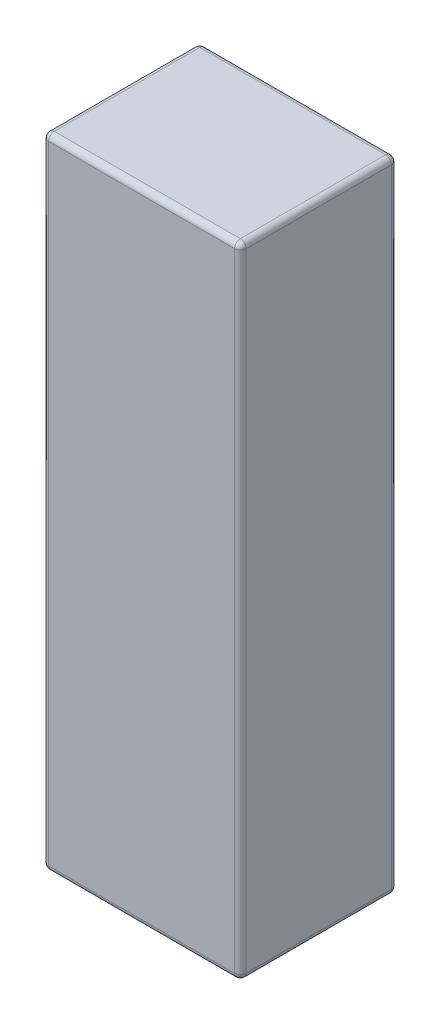
ISO-10303-21;
HEADER;
FILE_DESCRIPTION(('STEP AP214'),'2;1');
FILE_NAME('part.step','',(''),(''),'','','');
FILE_SCHEMA(('AUTOMOTIVE_DESIGN { 1 0 10303 214 1 1 1 1 }'));
ENDSEC;
DATA;
#1=APPLICATION_CONTEXT('core data for automotive mechanical design processes');
#2=APPLICATION_PROTOCOL_DEFINITION('international standard','automotive_design',2000,#1);
#3=PRODUCT_CONTEXT('',#1,'mechanical');
#4=PRODUCT('Part','Part','',(#3));
#5=PRODUCT_RELATED_PRODUCT_CATEGORY('part','',(#4));
#6=PRODUCT_DEFINITION_FORMATION('','',#4);
#7=PRODUCT_DEFINITION_CONTEXT('part definition',#1,'design');
#8=PRODUCT_DEFINITION('design','',#6,#7);
#9=PRODUCT_DEFINITION_SHAPE('','',#8);
#10=(LENGTH_UNIT() NAMED_UNIT(*) SI_UNIT(.MILLI.,.METRE.));
#11=(NAMED_UNIT(*) PLANE_ANGLE_UNIT() SI_UNIT($,.RADIAN.));
#12=(NAMED_UNIT(*) SI_UNIT($,.STERADIAN.) SOLID_ANGLE_UNIT());
#13=UNCERTAINTY_MEASURE_WITH_UNIT(LENGTH_MEASURE(1.E-05),#10,'distance_accuracy_value','');
#14=(GEOMETRIC_REPRESENTATION_CONTEXT(3) GLOBAL_UNCERTAINTY_ASSIGNED_CONTEXT((#13)) GLOBAL_UNIT_ASSIGNED_CONTEXT((#10,
#11,#12)) REPRESENTATION_CONTEXT('',''));
#15=CARTESIAN_POINT('',(0.,0.,0.));
#16=DIRECTION('',(0.,0.,1.));
#17=DIRECTION('',(1.,0.,0.));
#18=AXIS2_PLACEMENT_3D('',#15,#16,#17);
#19=CARTESIAN_POINT('',(8.5,55.,-6.75));
#20=DIRECTION('',(-1.,0.,0.));
#21=DIRECTION('',(0.,0.,1.));
#22=AXIS2_PLACEMENT_3D('',#19,#20,#21);
#23=PLANE('',#22);
#24=DIRECTION('',(0.,-1.,0.));
#25=VECTOR('',#24,1.);
#26=CARTESIAN_POINT('',(8.5,55.,-6.25));
#27=LINE('',#26,#25);
#28=CARTESIAN_POINT('',(8.5,0.5,-6.25));
#29=VERTEX_POINT('',#28);
#30=CARTESIAN_POINT('',(8.5,54.5,-6.25));
#31=VERTEX_POINT('',#30);
#32=EDGE_CURVE('E157',#29,#31,#27,.F.);
#33=ORIENTED_EDGE('',*,*,#32,.T.);
#34=DIRECTION('',(0.,0.,-1.));
#35=VECTOR('',#34,1.);
#36=CARTESIAN_POINT('',(8.5,54.5,6.75));
#37=LINE('',#36,#35);
#38=CARTESIAN_POINT('',(8.5,54.5,6.25));
#39=VERTEX_POINT('',#38);
#40=EDGE_CURVE('E130',#31,#39,#37,.F.);
#41=ORIENTED_EDGE('',*,*,#40,.T.);
#42=DIRECTION('',(0.,-1.,0.));
#43=VECTOR('',#42,1.);
#44=CARTESIAN_POINT('',(8.5,55.,6.25));
#45=LINE('',#44,#43);
#46=CARTESIAN_POINT('',(8.5,0.5,6.25));
#47=VERTEX_POINT('',#46);
#48=EDGE_CURVE('E165',#39,#47,#45,.T.);
#49=ORIENTED_EDGE('',*,*,#48,.T.);
#50=DIRECTION('',(0.,0.,-1.));
#51=VECTOR('',#50,1.);
#52=CARTESIAN_POINT('',(8.5,0.5,-6.75));
#53=LINE('',#52,#51);
#54=EDGE_CURVE('E159',#47,#29,#53,.T.);
#55=ORIENTED_EDGE('',*,*,#54,.T.);
#56=EDGE_LOOP('',(#33,#41,#49,#55));
#57=FACE_BOUND('',#56,.T.);
#58=ADVANCED_FACE('F34',(#57),#23,.F.);
#59=CARTESIAN_POINT('',(-8.5,55.,-6.75));
#60=DIRECTION('',(0.,0.,1.));
#61=DIRECTION('',(1.,0.,0.));
#62=AXIS2_PLACEMENT_3D('',#59,#60,#61);
#63=PLANE('',#62);
#64=DIRECTION('',(-1.,0.,0.));
#65=VECTOR('',#64,1.);
#66=CARTESIAN_POINT('',(8.5,54.5,-6.75));
#67=LINE('',#66,#65);
#68=CARTESIAN_POINT('',(-8.,54.5,-6.75));
#69=VERTEX_POINT('',#68);
#70=CARTESIAN_POINT('',(8.,54.5,-6.75));
#71=VERTEX_POINT('',#70);
#72=EDGE_CURVE('E43',#69,#71,#67,.F.);
#73=ORIENTED_EDGE('',*,*,#72,.T.);
#74=DIRECTION('',(0.,-1.,0.));
#75=VECTOR('',#74,1.);
#76=CARTESIAN_POINT('',(8.,55.,-6.75));
#77=LINE('',#76,#75);
#78=CARTESIAN_POINT('',(8.,0.5,-6.75));
#79=VERTEX_POINT('',#78);
#80=EDGE_CURVE('E11',#71,#79,#77,.T.);
#81=ORIENTED_EDGE('',*,*,#80,.T.);
#82=DIRECTION('',(-1.,0.,0.));
#83=VECTOR('',#82,1.);
#84=CARTESIAN_POINT('',(-8.5,0.5,-6.75));
#85=LINE('',#84,#83);
#86=CARTESIAN_POINT('',(-8.,0.5,-6.75));
#87=VERTEX_POINT('',#86);
#88=EDGE_CURVE('E195',#79,#87,#85,.T.);
#89=ORIENTED_EDGE('',*,*,#88,.T.);
#90=DIRECTION('',(0.,-1.,0.));
#91=VECTOR('',#90,1.);
#92=CARTESIAN_POINT('',(-8.,55.,-6.75));
#93=LINE('',#92,#91);
#94=EDGE_CURVE('E54',#87,#69,#93,.F.);
#95=ORIENTED_EDGE('',*,*,#94,.T.);
#96=EDGE_LOOP('',(#73,#81,#89,#95));
#97=FACE_BOUND('',#96,.T.);
#98=ADVANCED_FACE('F322',(#97),#63,.F.);
#99=CARTESIAN_POINT('',(-8.5,55.,-6.75));
#100=DIRECTION('',(1.,0.,0.));
#101=DIRECTION('',(0.,0.,-1.));
#102=AXIS2_PLACEMENT_3D('',#99,#100,#101);
#103=PLANE('',#102);
#104=DIRECTION('',(0.,-1.,0.));
#105=VECTOR('',#104,1.);
#106=CARTESIAN_POINT('',(-8.5,55.,6.25));
#107=LINE('',#106,#105);
#108=CARTESIAN_POINT('',(-8.5,0.5,6.25));
#109=VERTEX_POINT('',#108);
#110=CARTESIAN_POINT('',(-8.5,54.5,6.25));
#111=VERTEX_POINT('',#110);
#112=EDGE_CURVE('E190',#109,#111,#107,.F.);
#113=ORIENTED_EDGE('',*,*,#112,.T.);
#114=DIRECTION('',(0.,0.,1.));
#115=VECTOR('',#114,1.);
#116=CARTESIAN_POINT('',(-8.5,54.5,-6.75));
#117=LINE('',#116,#115);
#118=CARTESIAN_POINT('',(-8.5,54.5,-6.25));
#119=VERTEX_POINT('',#118);
#120=EDGE_CURVE('E192',#111,#119,#117,.F.);
#121=ORIENTED_EDGE('',*,*,#120,.T.);
#122=DIRECTION('',(0.,-1.,0.));
#123=VECTOR('',#122,1.);
#124=CARTESIAN_POINT('',(-8.5,55.,-6.25));
#125=LINE('',#124,#123);
#126=CARTESIAN_POINT('',(-8.5,0.5,-6.25));
#127=VERTEX_POINT('',#126);
#128=EDGE_CURVE('E186',#119,#127,#125,.T.);
#129=ORIENTED_EDGE('',*,*,#128,.T.);
#130=DIRECTION('',(0.,0.,1.));
#131=VECTOR('',#130,1.);
#132=CARTESIAN_POINT('',(-8.5,0.5,-6.75));
#133=LINE('',#132,#131);
#134=EDGE_CURVE('E188',#127,#109,#133,.T.);
#135=ORIENTED_EDGE('',*,*,#134,.T.);
#136=EDGE_LOOP('',(#113,#121,#129,#135));
#137=FACE_BOUND('',#136,.T.);
#138=ADVANCED_FACE('F301',(#137),#103,.F.);
#139=CARTESIAN_POINT('',(-8.5,55.,6.75));
#140=DIRECTION('',(0.,0.,-1.));
#141=DIRECTION('',(-1.,0.,0.));
#142=AXIS2_PLACEMENT_3D('',#139,#140,#141);
#143=PLANE('',#142);
#144=DIRECTION('',(0.,-1.,0.));
#145=VECTOR('',#144,1.);
#146=CARTESIAN_POINT('',(8.,55.,6.75));
#147=LINE('',#146,#145);
#148=CARTESIAN_POINT('',(8.,0.5,6.75));
#149=VERTEX_POINT('',#148);
#150=CARTESIAN_POINT('',(8.,54.5,6.75));
#151=VERTEX_POINT('',#150);
#152=EDGE_CURVE('E172',#149,#151,#147,.F.);
#153=ORIENTED_EDGE('',*,*,#152,.T.);
#154=DIRECTION('',(1.,0.,0.));
#155=VECTOR('',#154,1.);
#156=CARTESIAN_POINT('',(-8.5,54.5,6.75));
#157=LINE('',#156,#155);
#158=CARTESIAN_POINT('',(-8.,54.5,6.75));
#159=VERTEX_POINT('',#158);
#160=EDGE_CURVE('E174',#151,#159,#157,.F.);
#161=ORIENTED_EDGE('',*,*,#160,.T.);
#162=DIRECTION('',(0.,-1.,0.));
#163=VECTOR('',#162,1.);
#164=CARTESIAN_POINT('',(-8.,55.,6.75));
#165=LINE('',#164,#163);
#166=CARTESIAN_POINT('',(-8.,0.5,6.75));
#167=VERTEX_POINT('',#166);
#168=EDGE_CURVE('E168',#159,#167,#165,.T.);
#169=ORIENTED_EDGE('',*,*,#168,.T.);
#170=DIRECTION('',(1.,0.,0.));
#171=VECTOR('',#170,1.);
#172=CARTESIAN_POINT('',(-8.5,0.5,6.75));
#173=LINE('',#172,#171);
#174=EDGE_CURVE('E170',#167,#149,#173,.T.);
#175=ORIENTED_EDGE('',*,*,#174,.T.);
#176=EDGE_LOOP('',(#153,#161,#169,#175));
#177=FACE_BOUND('',#176,.T.);
#178=ADVANCED_FACE('F287',(#177),#143,.F.);
#179=CARTESIAN_POINT('',(0.,55.,0.));
#180=DIRECTION('',(0.,1.,0.));
#181=DIRECTION('',(0.,0.,1.));
#182=AXIS2_PLACEMENT_3D('',#179,#180,#181);
#183=PLANE('',#182);
#184=DIRECTION('',(1.,0.,0.));
#185=VECTOR('',#184,1.);
#186=CARTESIAN_POINT('',(8.5,55.,6.25));
#187=LINE('',#186,#185);
#188=CARTESIAN_POINT('',(-8.,55.,6.25));
#189=VERTEX_POINT('',#188);
#190=CARTESIAN_POINT('',(8.,55.,6.25));
#191=VERTEX_POINT('',#190);
#192=EDGE_CURVE('E155',#189,#191,#187,.T.);
#193=ORIENTED_EDGE('',*,*,#192,.T.);
#194=DIRECTION('',(0.,0.,-1.));
#195=VECTOR('',#194,1.);
#196=CARTESIAN_POINT('',(8.,55.,-6.75));
#197=LINE('',#196,#195);
#198=CARTESIAN_POINT('',(8.,55.,-6.25));
#199=VERTEX_POINT('',#198);
#200=EDGE_CURVE('E128',#191,#199,#197,.T.);
#201=ORIENTED_EDGE('',*,*,#200,.T.);
#202=DIRECTION('',(-1.,0.,0.));
#203=VECTOR('',#202,1.);
#204=CARTESIAN_POINT('',(-8.5,55.,-6.25));
#205=LINE('',#204,#203);
#206=CARTESIAN_POINT('',(-8.,55.,-6.25));
#207=VERTEX_POINT('',#206);
#208=EDGE_CURVE('E145',#199,#207,#205,.T.);
#209=ORIENTED_EDGE('',*,*,#208,.T.);
#210=DIRECTION('',(0.,0.,1.));
#211=VECTOR('',#210,1.);
#212=CARTESIAN_POINT('',(-8.,55.,6.75));
#213=LINE('',#212,#211);
#214=EDGE_CURVE('E151',#207,#189,#213,.T.);
#215=ORIENTED_EDGE('',*,*,#214,.T.);
#216=EDGE_LOOP('',(#193,#201,#209,#215));
#217=FACE_BOUND('',#216,.T.);
#218=ADVANCED_FACE('F153',(#217),#183,.T.);
#219=CARTESIAN_POINT('',(0.,0.,0.));
#220=DIRECTION('',(0.,1.,0.));
#221=DIRECTION('',(0.,0.,1.));
#222=AXIS2_PLACEMENT_3D('',#219,#220,#221);
#223=PLANE('',#222);
#224=DIRECTION('',(0.,0.,-1.));
#225=VECTOR('',#224,1.);
#226=CARTESIAN_POINT('',(8.,0.,0.));
#227=LINE('',#226,#225);
#228=CARTESIAN_POINT('',(8.,0.,-6.25));
#229=VERTEX_POINT('',#228);
#230=CARTESIAN_POINT('',(8.,0.,6.25));
#231=VERTEX_POINT('',#230);
#232=EDGE_CURVE('E181',#229,#231,#227,.F.);
#233=ORIENTED_EDGE('',*,*,#232,.T.);
#234=DIRECTION('',(1.,0.,0.));
#235=VECTOR('',#234,1.);
#236=CARTESIAN_POINT('',(0.,0.,6.25));
#237=LINE('',#236,#235);
#238=CARTESIAN_POINT('',(-8.,0.,6.25));
#239=VERTEX_POINT('',#238);
#240=EDGE_CURVE('E183',#231,#239,#237,.F.);
#241=ORIENTED_EDGE('',*,*,#240,.T.);
#242=DIRECTION('',(0.,0.,1.));
#243=VECTOR('',#242,1.);
#244=CARTESIAN_POINT('',(-8.,0.,0.));
#245=LINE('',#244,#243);
#246=CARTESIAN_POINT('',(-8.,0.,-6.25));
#247=VERTEX_POINT('',#246);
#248=EDGE_CURVE('E179',#239,#247,#245,.F.);
#249=ORIENTED_EDGE('',*,*,#248,.T.);
#250=DIRECTION('',(-1.,0.,0.));
#251=VECTOR('',#250,1.);
#252=CARTESIAN_POINT('',(0.,0.,-6.25));
#253=LINE('',#252,#251);
#254=EDGE_CURVE('E177',#247,#229,#253,.F.);
#255=ORIENTED_EDGE('',*,*,#254,.T.);
#256=EDGE_LOOP('',(#233,#241,#249,#255));
#257=FACE_BOUND('',#256,.T.);
#258=ADVANCED_FACE('F266',(#257),#223,.F.);
#259=CARTESIAN_POINT('',(-8.,0.5,-6.75));
#260=DIRECTION('',(0.,0.,1.));
#261=DIRECTION('',(1.,0.,0.));
#262=AXIS2_PLACEMENT_3D('',#259,#260,#261);
#263=CYLINDRICAL_SURFACE('',#262,0.5);
#264=CARTESIAN_POINT('',(-8.,0.5,6.25));
#265=DIRECTION('',(0.,0.,1.));
#266=DIRECTION('',(1.,0.,0.));
#267=AXIS2_PLACEMENT_3D('',#264,#265,#266);
#268=CIRCLE('',#267,0.5);
#269=EDGE_CURVE('E38',#109,#239,#268,.T.);
#270=ORIENTED_EDGE('',*,*,#269,.F.);
#271=ORIENTED_EDGE('',*,*,#134,.F.);
#272=CARTESIAN_POINT('',(-8.,0.5,-6.25));
#273=DIRECTION('',(0.,0.,-1.));
#274=DIRECTION('',(-1.,0.,0.));
#275=AXIS2_PLACEMENT_3D('',#272,#273,#274);
#276=CIRCLE('',#275,0.5);
#277=EDGE_CURVE('E247',#247,#127,#276,.T.);
#278=ORIENTED_EDGE('',*,*,#277,.F.);
#279=ORIENTED_EDGE('',*,*,#248,.F.);
#280=EDGE_LOOP('',(#270,#271,#278,#279));
#281=FACE_BOUND('',#280,.T.);
#282=ADVANCED_FACE('F36',(#281),#263,.T.);
#283=CARTESIAN_POINT('',(-8.,0.5,6.25));
#284=DIRECTION('',(0.,0.,1.));
#285=DIRECTION('',(1.,0.,0.));
#286=AXIS2_PLACEMENT_3D('',#283,#284,#285);
#287=SPHERICAL_SURFACE('',#286,0.5);
#288=CARTESIAN_POINT('',(-8.,0.5,6.25));
#289=DIRECTION('',(0.,-1.,0.));
#290=DIRECTION('',(0.,0.,-1.));
#291=AXIS2_PLACEMENT_3D('',#288,#289,#290);
#292=CIRCLE('',#291,0.5);
#293=EDGE_CURVE('E243',#109,#167,#292,.F.);
#294=ORIENTED_EDGE('',*,*,#293,.F.);
#295=ORIENTED_EDGE('',*,*,#269,.T.);
#296=CARTESIAN_POINT('',(-8.,0.5,6.25));
#297=DIRECTION('',(-1.,0.,0.));
#298=DIRECTION('',(0.,0.,1.));
#299=AXIS2_PLACEMENT_3D('',#296,#297,#298);
#300=CIRCLE('',#299,0.5);
#301=EDGE_CURVE('E246',#167,#239,#300,.F.);
#302=ORIENTED_EDGE('',*,*,#301,.F.);
#303=EDGE_LOOP('',(#294,#295,#302));
#304=FACE_BOUND('',#303,.T.);
#305=ADVANCED_FACE('F259',(#304),#287,.T.);
#306=CARTESIAN_POINT('',(-8.,0.5,-6.25));
#307=DIRECTION('',(0.,0.,1.));
#308=DIRECTION('',(1.,0.,0.));
#309=AXIS2_PLACEMENT_3D('',#306,#307,#308);
#310=SPHERICAL_SURFACE('',#309,0.5);
#311=CARTESIAN_POINT('',(-8.,0.5,-6.25));
#312=DIRECTION('',(-1.,0.,0.));
#313=DIRECTION('',(0.,0.,1.));
#314=AXIS2_PLACEMENT_3D('',#311,#312,#313);
#315=CIRCLE('',#314,0.5);
#316=EDGE_CURVE('E237',#247,#87,#315,.F.);
#317=ORIENTED_EDGE('',*,*,#316,.F.);
#318=ORIENTED_EDGE('',*,*,#277,.T.);
#319=CARTESIAN_POINT('',(-8.,0.5,-6.25));
#320=DIRECTION('',(0.,-1.,0.));
#321=DIRECTION('',(0.,0.,-1.));
#322=AXIS2_PLACEMENT_3D('',#319,#320,#321);
#323=CIRCLE('',#322,0.5);
#324=EDGE_CURVE('E240',#87,#127,#323,.F.);
#325=ORIENTED_EDGE('',*,*,#324,.F.);
#326=EDGE_LOOP('',(#317,#318,#325));
#327=FACE_BOUND('',#326,.T.);
#328=ADVANCED_FACE('F309',(#327),#310,.T.);
#329=CARTESIAN_POINT('',(-8.5,0.5,6.25));
#330=DIRECTION('',(1.,0.,0.));
#331=DIRECTION('',(0.,0.,-1.));
#332=AXIS2_PLACEMENT_3D('',#329,#330,#331);
#333=CYLINDRICAL_SURFACE('',#332,0.5);
#334=ORIENTED_EDGE('',*,*,#301,.T.);
#335=ORIENTED_EDGE('',*,*,#240,.F.);
#336=CARTESIAN_POINT('',(8.,0.5,6.25));
#337=DIRECTION('',(1.,0.,0.));
#338=DIRECTION('',(0.,0.,-1.));
#339=AXIS2_PLACEMENT_3D('',#336,#337,#338);
#340=CIRCLE('',#339,0.5);
#341=EDGE_CURVE('E231',#149,#231,#340,.T.);
#342=ORIENTED_EDGE('',*,*,#341,.F.);
#343=ORIENTED_EDGE('',*,*,#174,.F.);
#344=EDGE_LOOP('',(#334,#335,#342,#343));
#345=FACE_BOUND('',#344,.T.);
#346=ADVANCED_FACE('F271',(#345),#333,.T.);
#347=CARTESIAN_POINT('',(-8.,55.,6.25));
#348=DIRECTION('',(0.,-1.,0.));
#349=DIRECTION('',(0.,0.,-1.));
#350=AXIS2_PLACEMENT_3D('',#347,#348,#349);
#351=CYLINDRICAL_SURFACE('',#350,0.5);
#352=ORIENTED_EDGE('',*,*,#293,.T.);
#353=ORIENTED_EDGE('',*,*,#168,.F.);
#354=CARTESIAN_POINT('',(-8.,54.5,6.25));
#355=DIRECTION('',(0.,1.,0.));
#356=DIRECTION('',(0.,0.,1.));
#357=AXIS2_PLACEMENT_3D('',#354,#355,#356);
#358=CIRCLE('',#357,0.5);
#359=EDGE_CURVE('E228',#111,#159,#358,.T.);
#360=ORIENTED_EDGE('',*,*,#359,.F.);
#361=ORIENTED_EDGE('',*,*,#112,.F.);
#362=EDGE_LOOP('',(#352,#353,#360,#361));
#363=FACE_BOUND('',#362,.T.);
#364=ADVANCED_FACE('F298',(#363),#351,.T.);
#365=CARTESIAN_POINT('',(-8.,54.5,0.));
#366=DIRECTION('',(0.,0.,-1.));
#367=DIRECTION('',(-1.,0.,0.));
#368=AXIS2_PLACEMENT_3D('',#365,#366,#367);
#369=CYLINDRICAL_SURFACE('',#368,0.5);
#370=CARTESIAN_POINT('',(-8.,54.5,-6.25));
#371=DIRECTION('',(0.,0.,-1.));
#372=DIRECTION('',(-1.,0.,0.));
#373=AXIS2_PLACEMENT_3D('',#370,#371,#372);
#374=CIRCLE('',#373,0.5);
#375=EDGE_CURVE('E222',#119,#207,#374,.T.);
#376=ORIENTED_EDGE('',*,*,#375,.F.);
#377=ORIENTED_EDGE('',*,*,#120,.F.);
#378=CARTESIAN_POINT('',(-8.,54.5,6.25));
#379=DIRECTION('',(0.,0.,1.));
#380=DIRECTION('',(1.,0.,0.));
#381=AXIS2_PLACEMENT_3D('',#378,#379,#380);
#382=CIRCLE('',#381,0.5);
#383=EDGE_CURVE('E225',#189,#111,#382,.T.);
#384=ORIENTED_EDGE('',*,*,#383,.F.);
#385=ORIENTED_EDGE('',*,*,#214,.F.);
#386=EDGE_LOOP('',(#376,#377,#384,#385));
#387=FACE_BOUND('',#386,.T.);
#388=ADVANCED_FACE('F304',(#387),#369,.T.);
#389=CARTESIAN_POINT('',(-8.,55.,-6.25));
#390=DIRECTION('',(0.,-1.,0.));
#391=DIRECTION('',(0.,0.,-1.));
#392=AXIS2_PLACEMENT_3D('',#389,#390,#391);
#393=CYLINDRICAL_SURFACE('',#392,0.5);
#394=ORIENTED_EDGE('',*,*,#324,.T.);
#395=ORIENTED_EDGE('',*,*,#128,.F.);
#396=CARTESIAN_POINT('',(-8.,54.5,-6.25));
#397=DIRECTION('',(0.,1.,0.));
#398=DIRECTION('',(0.,0.,1.));
#399=AXIS2_PLACEMENT_3D('',#396,#397,#398);
#400=CIRCLE('',#399,0.5);
#401=EDGE_CURVE('E220',#69,#119,#400,.T.);
#402=ORIENTED_EDGE('',*,*,#401,.F.);
#403=ORIENTED_EDGE('',*,*,#94,.F.);
#404=EDGE_LOOP('',(#394,#395,#402,#403));
#405=FACE_BOUND('',#404,.T.);
#406=ADVANCED_FACE('F308',(#405),#393,.T.);
#407=CARTESIAN_POINT('',(-8.5,0.5,-6.25));
#408=DIRECTION('',(-1.,0.,0.));
#409=DIRECTION('',(0.,0.,1.));
#410=AXIS2_PLACEMENT_3D('',#407,#408,#409);
#411=CYLINDRICAL_SURFACE('',#410,0.5);
#412=ORIENTED_EDGE('',*,*,#316,.T.);
#413=ORIENTED_EDGE('',*,*,#88,.F.);
#414=CARTESIAN_POINT('',(8.,0.5,-6.25));
#415=DIRECTION('',(1.,0.,0.));
#416=DIRECTION('',(0.,0.,-1.));
#417=AXIS2_PLACEMENT_3D('',#414,#415,#416);
#418=CIRCLE('',#417,0.5);
#419=EDGE_CURVE('E217',#229,#79,#418,.T.);
#420=ORIENTED_EDGE('',*,*,#419,.F.);
#421=ORIENTED_EDGE('',*,*,#254,.F.);
#422=EDGE_LOOP('',(#412,#413,#420,#421));
#423=FACE_BOUND('',#422,.T.);
#424=ADVANCED_FACE('F313',(#423),#411,.T.);
#425=CARTESIAN_POINT('',(8.,0.5,-6.75));
#426=DIRECTION('',(0.,0.,-1.));
#427=DIRECTION('',(-1.,0.,0.));
#428=AXIS2_PLACEMENT_3D('',#425,#426,#427);
#429=CYLINDRICAL_SURFACE('',#428,0.5);
#430=CARTESIAN_POINT('',(8.,0.5,6.25));
#431=DIRECTION('',(0.,0.,1.));
#432=DIRECTION('',(1.,0.,0.));
#433=AXIS2_PLACEMENT_3D('',#430,#431,#432);
#434=CIRCLE('',#433,0.5);
#435=EDGE_CURVE('E234',#231,#47,#434,.T.);
#436=ORIENTED_EDGE('',*,*,#435,.F.);
#437=ORIENTED_EDGE('',*,*,#232,.F.);
#438=CARTESIAN_POINT('',(8.,0.5,-6.25));
#439=DIRECTION('',(0.,0.,-1.));
#440=DIRECTION('',(-1.,0.,0.));
#441=AXIS2_PLACEMENT_3D('',#438,#439,#440);
#442=CIRCLE('',#441,0.5);
#443=EDGE_CURVE('E214',#29,#229,#442,.T.);
#444=ORIENTED_EDGE('',*,*,#443,.F.);
#445=ORIENTED_EDGE('',*,*,#54,.F.);
#446=EDGE_LOOP('',(#436,#437,#444,#445));
#447=FACE_BOUND('',#446,.T.);
#448=ADVANCED_FACE('F275',(#447),#429,.T.);
#449=CARTESIAN_POINT('',(8.,0.5,6.25));
#450=DIRECTION('',(0.,0.,1.));
#451=DIRECTION('',(1.,0.,0.));
#452=AXIS2_PLACEMENT_3D('',#449,#450,#451);
#453=SPHERICAL_SURFACE('',#452,0.5);
#454=ORIENTED_EDGE('',*,*,#341,.T.);
#455=ORIENTED_EDGE('',*,*,#435,.T.);
#456=CARTESIAN_POINT('',(8.,0.5,6.25));
#457=DIRECTION('',(0.,-1.,0.));
#458=DIRECTION('',(0.,0.,-1.));
#459=AXIS2_PLACEMENT_3D('',#456,#457,#458);
#460=CIRCLE('',#459,0.5);
#461=EDGE_CURVE('E211',#149,#47,#460,.F.);
#462=ORIENTED_EDGE('',*,*,#461,.F.);
#463=EDGE_LOOP('',(#454,#455,#462));
#464=FACE_BOUND('',#463,.T.);
#465=ADVANCED_FACE('F279',(#464),#453,.T.);
#466=CARTESIAN_POINT('',(-8.,54.5,6.25));
#467=DIRECTION('',(0.,0.,1.));
#468=DIRECTION('',(1.,0.,0.));
#469=AXIS2_PLACEMENT_3D('',#466,#467,#468);
#470=SPHERICAL_SURFACE('',#469,0.5);
#471=ORIENTED_EDGE('',*,*,#383,.T.);
#472=ORIENTED_EDGE('',*,*,#359,.T.);
#473=CARTESIAN_POINT('',(-8.,54.5,6.25));
#474=DIRECTION('',(-1.,0.,0.));
#475=DIRECTION('',(0.,0.,1.));
#476=AXIS2_PLACEMENT_3D('',#473,#474,#475);
#477=CIRCLE('',#476,0.5);
#478=EDGE_CURVE('E209',#189,#159,#477,.F.);
#479=ORIENTED_EDGE('',*,*,#478,.F.);
#480=EDGE_LOOP('',(#471,#472,#479));
#481=FACE_BOUND('',#480,.T.);
#482=ADVANCED_FACE('F295',(#481),#470,.T.);
#483=CARTESIAN_POINT('',(-8.,54.5,-6.25));
#484=DIRECTION('',(0.,0.,1.));
#485=DIRECTION('',(1.,0.,0.));
#486=AXIS2_PLACEMENT_3D('',#483,#484,#485);
#487=SPHERICAL_SURFACE('',#486,0.5);
#488=ORIENTED_EDGE('',*,*,#401,.T.);
#489=ORIENTED_EDGE('',*,*,#375,.T.);
#490=CARTESIAN_POINT('',(-8.,54.5,-6.25));
#491=DIRECTION('',(-1.,0.,0.));
#492=DIRECTION('',(0.,0.,1.));
#493=AXIS2_PLACEMENT_3D('',#490,#491,#492);
#494=CIRCLE('',#493,0.5);
#495=EDGE_CURVE('E148',#69,#207,#494,.F.);
#496=ORIENTED_EDGE('',*,*,#495,.F.);
#497=EDGE_LOOP('',(#488,#489,#496));
#498=FACE_BOUND('',#497,.T.);
#499=ADVANCED_FACE('F348',(#498),#487,.T.);
#500=CARTESIAN_POINT('',(8.,0.5,-6.25));
#501=DIRECTION('',(0.,0.,1.));
#502=DIRECTION('',(1.,0.,0.));
#503=AXIS2_PLACEMENT_3D('',#500,#501,#502);
#504=SPHERICAL_SURFACE('',#503,0.5);
#505=ORIENTED_EDGE('',*,*,#443,.T.);
#506=ORIENTED_EDGE('',*,*,#419,.T.);
#507=CARTESIAN_POINT('',(8.,0.5,-6.25));
#508=DIRECTION('',(0.,-1.,0.));
#509=DIRECTION('',(0.,0.,-1.));
#510=AXIS2_PLACEMENT_3D('',#507,#508,#509);
#511=CIRCLE('',#510,0.5);
#512=EDGE_CURVE('E206',#29,#79,#511,.F.);
#513=ORIENTED_EDGE('',*,*,#512,.F.);
#514=EDGE_LOOP('',(#505,#506,#513));
#515=FACE_BOUND('',#514,.T.);
#516=ADVANCED_FACE('F316',(#515),#504,.T.);
#517=CARTESIAN_POINT('',(8.,55.,6.25));
#518=DIRECTION('',(0.,-1.,0.));
#519=DIRECTION('',(0.,0.,-1.));
#520=AXIS2_PLACEMENT_3D('',#517,#518,#519);
#521=CYLINDRICAL_SURFACE('',#520,0.5);
#522=ORIENTED_EDGE('',*,*,#461,.T.);
#523=ORIENTED_EDGE('',*,*,#48,.F.);
#524=CARTESIAN_POINT('',(8.,54.5,6.25));
#525=DIRECTION('',(0.,1.,0.));
#526=DIRECTION('',(0.,0.,1.));
#527=AXIS2_PLACEMENT_3D('',#524,#525,#526);
#528=CIRCLE('',#527,0.5);
#529=EDGE_CURVE('E203',#151,#39,#528,.T.);
#530=ORIENTED_EDGE('',*,*,#529,.F.);
#531=ORIENTED_EDGE('',*,*,#152,.F.);
#532=EDGE_LOOP('',(#522,#523,#530,#531));
#533=FACE_BOUND('',#532,.T.);
#534=ADVANCED_FACE('F284',(#533),#521,.T.);
#535=CARTESIAN_POINT('',(0.,54.5,6.25));
#536=DIRECTION('',(-1.,0.,0.));
#537=DIRECTION('',(0.,0.,1.));
#538=AXIS2_PLACEMENT_3D('',#535,#536,#537);
#539=CYLINDRICAL_SURFACE('',#538,0.5);
#540=ORIENTED_EDGE('',*,*,#478,.T.);
#541=ORIENTED_EDGE('',*,*,#160,.F.);
#542=CARTESIAN_POINT('',(8.,54.5,6.25));
#543=DIRECTION('',(1.,0.,0.));
#544=DIRECTION('',(0.,0.,-1.));
#545=AXIS2_PLACEMENT_3D('',#542,#543,#544);
#546=CIRCLE('',#545,0.5);
#547=EDGE_CURVE('E142',#191,#151,#546,.T.);
#548=ORIENTED_EDGE('',*,*,#547,.F.);
#549=ORIENTED_EDGE('',*,*,#192,.F.);
#550=EDGE_LOOP('',(#540,#541,#548,#549));
#551=FACE_BOUND('',#550,.T.);
#552=ADVANCED_FACE('F289',(#551),#539,.T.);
#553=CARTESIAN_POINT('',(0.,54.5,-6.25));
#554=DIRECTION('',(1.,0.,0.));
#555=DIRECTION('',(0.,0.,-1.));
#556=AXIS2_PLACEMENT_3D('',#553,#554,#555);
#557=CYLINDRICAL_SURFACE('',#556,0.5);
#558=ORIENTED_EDGE('',*,*,#495,.T.);
#559=ORIENTED_EDGE('',*,*,#208,.F.);
#560=CARTESIAN_POINT('',(8.,54.5,-6.25));
#561=DIRECTION('',(1.,0.,0.));
#562=DIRECTION('',(0.,0.,-1.));
#563=AXIS2_PLACEMENT_3D('',#560,#561,#562);
#564=CIRCLE('',#563,0.5);
#565=EDGE_CURVE('E136',#71,#199,#564,.T.);
#566=ORIENTED_EDGE('',*,*,#565,.F.);
#567=ORIENTED_EDGE('',*,*,#72,.F.);
#568=EDGE_LOOP('',(#558,#559,#566,#567));
#569=FACE_BOUND('',#568,.T.);
#570=ADVANCED_FACE('F146',(#569),#557,.T.);
#571=CARTESIAN_POINT('',(8.,55.,-6.25));
#572=DIRECTION('',(0.,-1.,0.));
#573=DIRECTION('',(0.,0.,-1.));
#574=AXIS2_PLACEMENT_3D('',#571,#572,#573);
#575=CYLINDRICAL_SURFACE('',#574,0.5);
#576=ORIENTED_EDGE('',*,*,#512,.T.);
#577=ORIENTED_EDGE('',*,*,#80,.F.);
#578=CARTESIAN_POINT('',(8.,54.5,-6.25));
#579=DIRECTION('',(0.,1.,0.));
#580=DIRECTION('',(0.,0.,1.));
#581=AXIS2_PLACEMENT_3D('',#578,#579,#580);
#582=CIRCLE('',#581,0.5);
#583=EDGE_CURVE('E140',#31,#71,#582,.T.);
#584=ORIENTED_EDGE('',*,*,#583,.F.);
#585=ORIENTED_EDGE('',*,*,#32,.F.);
#586=EDGE_LOOP('',(#576,#577,#584,#585));
#587=FACE_BOUND('',#586,.T.);
#588=ADVANCED_FACE('F319',(#587),#575,.T.);
#589=CARTESIAN_POINT('',(8.,54.5,6.25));
#590=DIRECTION('',(0.,0.,1.));
#591=DIRECTION('',(1.,0.,0.));
#592=AXIS2_PLACEMENT_3D('',#589,#590,#591);
#593=SPHERICAL_SURFACE('',#592,0.5);
#594=ORIENTED_EDGE('',*,*,#547,.T.);
#595=ORIENTED_EDGE('',*,*,#529,.T.);
#596=CARTESIAN_POINT('',(8.,54.5,6.25));
#597=DIRECTION('',(0.,0.,1.));
#598=DIRECTION('',(1.,0.,0.));
#599=AXIS2_PLACEMENT_3D('',#596,#597,#598);
#600=CIRCLE('',#599,0.5);
#601=EDGE_CURVE('E133',#191,#39,#600,.F.);
#602=ORIENTED_EDGE('',*,*,#601,.F.);
#603=EDGE_LOOP('',(#594,#595,#602));
#604=FACE_BOUND('',#603,.T.);
#605=ADVANCED_FACE('F334',(#604),#593,.T.);
#606=CARTESIAN_POINT('',(8.,54.5,-6.25));
#607=DIRECTION('',(0.,0.,1.));
#608=DIRECTION('',(1.,0.,0.));
#609=AXIS2_PLACEMENT_3D('',#606,#607,#608);
#610=SPHERICAL_SURFACE('',#609,0.5);
#611=ORIENTED_EDGE('',*,*,#583,.T.);
#612=ORIENTED_EDGE('',*,*,#565,.T.);
#613=CARTESIAN_POINT('',(8.,54.5,-6.25));
#614=DIRECTION('',(0.,0.,-1.));
#615=DIRECTION('',(-1.,0.,0.));
#616=AXIS2_PLACEMENT_3D('',#613,#614,#615);
#617=CIRCLE('',#616,0.5);
#618=EDGE_CURVE('E124',#31,#199,#617,.F.);
#619=ORIENTED_EDGE('',*,*,#618,.F.);
#620=EDGE_LOOP('',(#611,#612,#619));
#621=FACE_BOUND('',#620,.T.);
#622=ADVANCED_FACE('F138',(#621),#610,.T.);
#623=CARTESIAN_POINT('',(8.,54.5,0.));
#624=DIRECTION('',(0.,0.,1.));
#625=DIRECTION('',(1.,0.,0.));
#626=AXIS2_PLACEMENT_3D('',#623,#624,#625);
#627=CYLINDRICAL_SURFACE('',#626,0.5);
#628=ORIENTED_EDGE('',*,*,#601,.T.);
#629=ORIENTED_EDGE('',*,*,#40,.F.);
#630=ORIENTED_EDGE('',*,*,#618,.T.);
#631=ORIENTED_EDGE('',*,*,#200,.F.);
#632=EDGE_LOOP('',(#628,#629,#630,#631));
#633=FACE_BOUND('',#632,.T.);
#634=ADVANCED_FACE('F126',(#633),#627,.T.);
#635=CLOSED_SHELL('',(#58,#98,#138,#178,#218,#258,#282,#305,#328,#346,#364,#388,#406,#424,#448,
#465,#482,#499,#516,#534,#552,#570,#588,#605,#622,#634));
#636=MANIFOLD_SOLID_BREP('B2',#635);
#637=ADVANCED_BREP_SHAPE_REPRESENTATION('',(#18,#636),#14);
#638=SHAPE_DEFINITION_REPRESENTATION(#9,#637);
ENDSEC;
END-ISO-10303-21;
